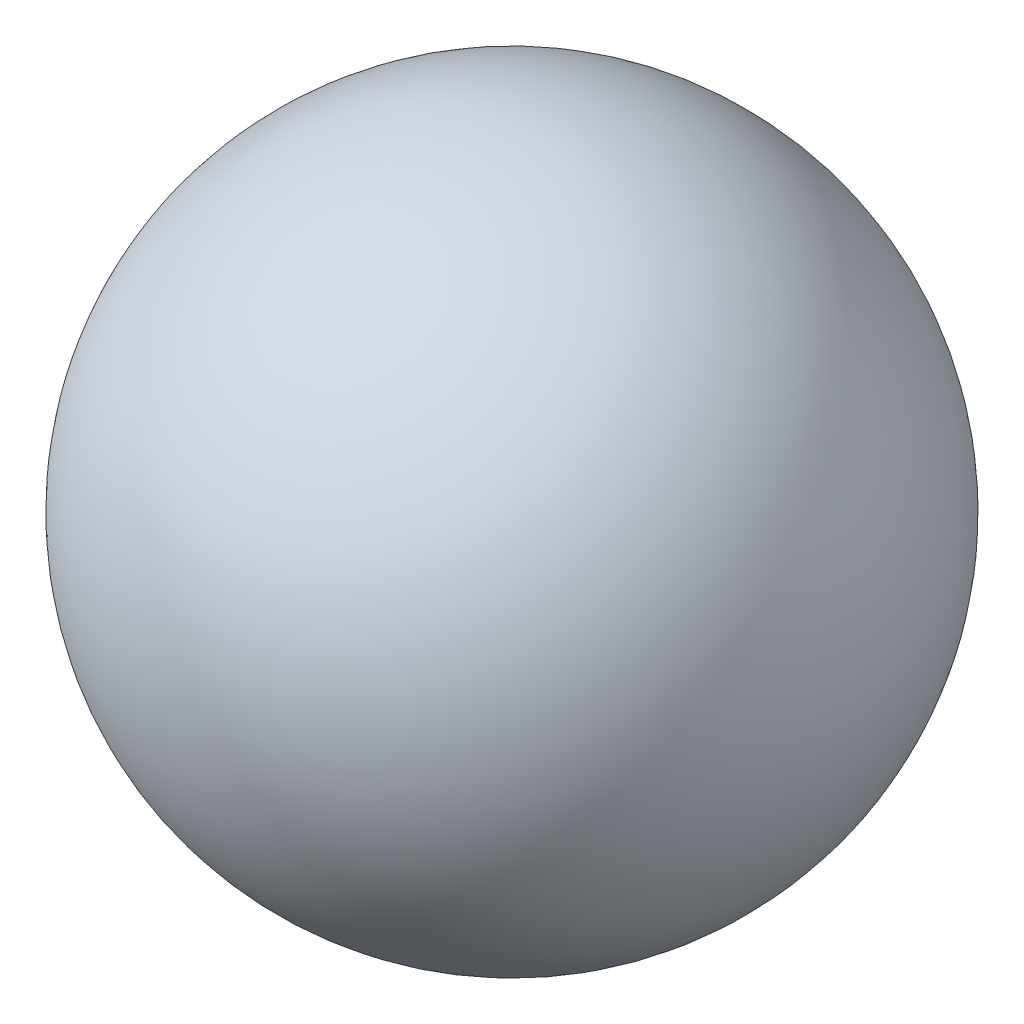
ISO-10303-21;
HEADER;
FILE_DESCRIPTION(('STEP AP214'),'2;1');
FILE_NAME('part.step','',(''),(''),'','','');
FILE_SCHEMA(('AUTOMOTIVE_DESIGN { 1 0 10303 214 1 1 1 1 }'));
ENDSEC;
DATA;
#1=APPLICATION_CONTEXT('core data for automotive mechanical design processes');
#2=APPLICATION_PROTOCOL_DEFINITION('international standard','automotive_design',2000,#1);
#3=PRODUCT_CONTEXT('',#1,'mechanical');
#4=PRODUCT('Part','Part','',(#3));
#5=PRODUCT_RELATED_PRODUCT_CATEGORY('part','',(#4));
#6=PRODUCT_DEFINITION_FORMATION('','',#4);
#7=PRODUCT_DEFINITION_CONTEXT('part definition',#1,'design');
#8=PRODUCT_DEFINITION('design','',#6,#7);
#9=PRODUCT_DEFINITION_SHAPE('','',#8);
#10=(LENGTH_UNIT() NAMED_UNIT(*) SI_UNIT(.MILLI.,.METRE.));
#11=(NAMED_UNIT(*) PLANE_ANGLE_UNIT() SI_UNIT($,.RADIAN.));
#12=(NAMED_UNIT(*) SI_UNIT($,.STERADIAN.) SOLID_ANGLE_UNIT());
#13=UNCERTAINTY_MEASURE_WITH_UNIT(LENGTH_MEASURE(1.E-05),#10,'distance_accuracy_value','');
#14=(GEOMETRIC_REPRESENTATION_CONTEXT(3) GLOBAL_UNCERTAINTY_ASSIGNED_CONTEXT((#13)) GLOBAL_UNIT_ASSIGNED_CONTEXT((#10,
#11,#12)) REPRESENTATION_CONTEXT('',''));
#15=CARTESIAN_POINT('',(0.,0.,0.));
#16=DIRECTION('',(0.,0.,1.));
#17=DIRECTION('',(1.,0.,0.));
#18=AXIS2_PLACEMENT_3D('',#15,#16,#17);
#19=CARTESIAN_POINT('',(0.,0.,0.));
#20=DIRECTION('',(-1.,0.,0.));
#21=DIRECTION('',(0.,1.,0.));
#22=AXIS2_PLACEMENT_3D('',#19,#20,#21);
#23=SPHERICAL_SURFACE('',#22,19.5);
#24=CARTESIAN_POINT('',(-19.5,0.,0.));
#25=VERTEX_POINT('',#24);
#26=VERTEX_LOOP('',#25);
#27=FACE_BOUND('',#26,.T.);
#28=ADVANCED_FACE('F27',(#27),#23,.T.);
#29=CLOSED_SHELL('',(#28));
#30=MANIFOLD_SOLID_BREP('B2',#29);
#31=ADVANCED_BREP_SHAPE_REPRESENTATION('',(#18,#30),#14);
#32=SHAPE_DEFINITION_REPRESENTATION(#9,#31);
ENDSEC;
END-ISO-10303-21;
